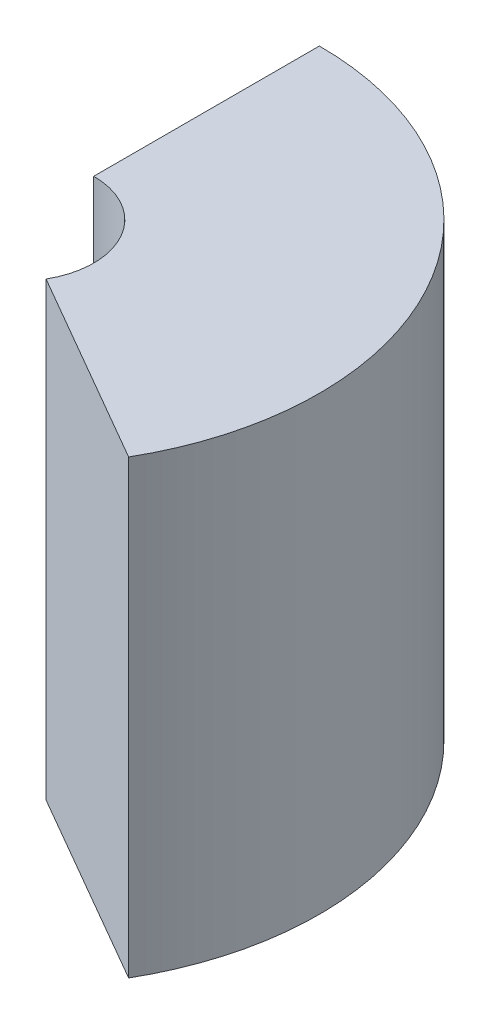
ISO-10303-21;
HEADER;
FILE_DESCRIPTION(('STEP AP214'),'2;1');
FILE_NAME('part.step','',(''),(''),'','','');
FILE_SCHEMA(('AUTOMOTIVE_DESIGN { 1 0 10303 214 1 1 1 1 }'));
ENDSEC;
DATA;
#1=APPLICATION_CONTEXT('core data for automotive mechanical design processes');
#2=APPLICATION_PROTOCOL_DEFINITION('international standard','automotive_design',2000,#1);
#3=PRODUCT_CONTEXT('',#1,'mechanical');
#4=PRODUCT('Part','Part','',(#3));
#5=PRODUCT_RELATED_PRODUCT_CATEGORY('part','',(#4));
#6=PRODUCT_DEFINITION_FORMATION('','',#4);
#7=PRODUCT_DEFINITION_CONTEXT('part definition',#1,'design');
#8=PRODUCT_DEFINITION('design','',#6,#7);
#9=PRODUCT_DEFINITION_SHAPE('','',#8);
#10=(LENGTH_UNIT() NAMED_UNIT(*) SI_UNIT(.MILLI.,.METRE.));
#11=(NAMED_UNIT(*) PLANE_ANGLE_UNIT() SI_UNIT($,.RADIAN.));
#12=(NAMED_UNIT(*) SI_UNIT($,.STERADIAN.) SOLID_ANGLE_UNIT());
#13=UNCERTAINTY_MEASURE_WITH_UNIT(LENGTH_MEASURE(1.E-05),#10,'distance_accuracy_value','');
#14=(GEOMETRIC_REPRESENTATION_CONTEXT(3) GLOBAL_UNCERTAINTY_ASSIGNED_CONTEXT((#13)) GLOBAL_UNIT_ASSIGNED_CONTEXT((#10,
#11,#12)) REPRESENTATION_CONTEXT('',''));
#15=CARTESIAN_POINT('',(0.,0.,0.));
#16=DIRECTION('',(0.,0.,1.));
#17=DIRECTION('',(1.,0.,0.));
#18=AXIS2_PLACEMENT_3D('',#15,#16,#17);
#19=CARTESIAN_POINT('',(0.,0.,0.));
#20=DIRECTION('',(0.,1.,0.));
#21=DIRECTION('',(0.,0.,1.));
#22=AXIS2_PLACEMENT_3D('',#19,#20,#21);
#23=CYLINDRICAL_SURFACE('',#22,5.);
#24=CARTESIAN_POINT('',(0.,0.,0.));
#25=DIRECTION('',(0.,1.,0.));
#26=DIRECTION('',(0.,0.,1.));
#27=AXIS2_PLACEMENT_3D('',#24,#25,#26);
#28=CIRCLE('',#27,5.);
#29=CARTESIAN_POINT('',(4.33012701892219,0.,2.5));
#30=VERTEX_POINT('',#29);
#31=CARTESIAN_POINT('',(0.,0.,-5.));
#32=VERTEX_POINT('',#31);
#33=EDGE_CURVE('E11',#30,#32,#28,.T.);
#34=ORIENTED_EDGE('',*,*,#33,.F.);
#35=DIRECTION('',(0.,-1.,0.));
#36=VECTOR('',#35,1.);
#37=CARTESIAN_POINT('',(4.33012701892219,30.,2.5));
#38=LINE('',#37,#36);
#39=CARTESIAN_POINT('',(4.33012701892219,30.,2.5));
#40=VERTEX_POINT('',#39);
#41=EDGE_CURVE('E103',#40,#30,#38,.T.);
#42=ORIENTED_EDGE('',*,*,#41,.F.);
#43=CARTESIAN_POINT('',(0.,30.,0.));
#44=DIRECTION('',(0.,1.,0.));
#45=DIRECTION('',(0.,0.,1.));
#46=AXIS2_PLACEMENT_3D('',#43,#44,#45);
#47=CIRCLE('',#46,5.);
#48=CARTESIAN_POINT('',(0.,30.,-5.));
#49=VERTEX_POINT('',#48);
#50=EDGE_CURVE('E56',#40,#49,#47,.T.);
#51=ORIENTED_EDGE('',*,*,#50,.T.);
#52=DIRECTION('',(0.,-1.,0.));
#53=VECTOR('',#52,1.);
#54=CARTESIAN_POINT('',(0.,30.,-5.));
#55=LINE('',#54,#53);
#56=EDGE_CURVE('E92',#49,#32,#55,.T.);
#57=ORIENTED_EDGE('',*,*,#56,.T.);
#58=EDGE_LOOP('',(#34,#42,#51,#57));
#59=FACE_BOUND('',#58,.T.);
#60=ADVANCED_FACE('F41',(#59),#23,.F.);
#61=CARTESIAN_POINT('',(4.33012701892219,0.,2.5));
#62=DIRECTION('',(0.,1.,0.));
#63=DIRECTION('',(0.,0.,1.));
#64=AXIS2_PLACEMENT_3D('',#61,#62,#63);
#65=PLANE('',#64);
#66=CARTESIAN_POINT('',(0.,0.,0.));
#67=DIRECTION('',(0.,1.,0.));
#68=DIRECTION('',(0.,0.,1.));
#69=AXIS2_PLACEMENT_3D('',#66,#67,#68);
#70=CIRCLE('',#69,20.);
#71=CARTESIAN_POINT('',(17.3205080756888,0.,9.99999999999999));
#72=VERTEX_POINT('',#71);
#73=CARTESIAN_POINT('',(0.,0.,-20.));
#74=VERTEX_POINT('',#73);
#75=EDGE_CURVE('E49',#72,#74,#70,.T.);
#76=ORIENTED_EDGE('',*,*,#75,.F.);
#77=DIRECTION('',(0.866025403784439,0.,0.5));
#78=VECTOR('',#77,1.);
#79=CARTESIAN_POINT('',(4.33012701892219,0.,2.5));
#80=LINE('',#79,#78);
#81=EDGE_CURVE('E88',#30,#72,#80,.T.);
#82=ORIENTED_EDGE('',*,*,#81,.F.);
#83=ORIENTED_EDGE('',*,*,#33,.T.);
#84=DIRECTION('',(0.,0.,-1.));
#85=VECTOR('',#84,1.);
#86=CARTESIAN_POINT('',(0.,0.,-5.));
#87=LINE('',#86,#85);
#88=EDGE_CURVE('E85',#32,#74,#87,.T.);
#89=ORIENTED_EDGE('',*,*,#88,.T.);
#90=EDGE_LOOP('',(#76,#82,#83,#89));
#91=FACE_BOUND('',#90,.T.);
#92=ADVANCED_FACE('F43',(#91),#65,.F.);
#93=CARTESIAN_POINT('',(0.,0.,0.));
#94=DIRECTION('',(0.,1.,0.));
#95=DIRECTION('',(0.,0.,1.));
#96=AXIS2_PLACEMENT_3D('',#93,#94,#95);
#97=CYLINDRICAL_SURFACE('',#96,20.);
#98=CARTESIAN_POINT('',(0.,30.,0.));
#99=DIRECTION('',(0.,1.,0.));
#100=DIRECTION('',(0.,0.,1.));
#101=AXIS2_PLACEMENT_3D('',#98,#99,#100);
#102=CIRCLE('',#101,20.);
#103=CARTESIAN_POINT('',(17.3205080756888,30.,9.99999999999999));
#104=VERTEX_POINT('',#103);
#105=CARTESIAN_POINT('',(0.,30.,-20.));
#106=VERTEX_POINT('',#105);
#107=EDGE_CURVE('E64',#104,#106,#102,.T.);
#108=ORIENTED_EDGE('',*,*,#107,.F.);
#109=DIRECTION('',(0.,1.,0.));
#110=VECTOR('',#109,1.);
#111=CARTESIAN_POINT('',(17.3205080756888,0.,9.99999999999999));
#112=LINE('',#111,#110);
#113=EDGE_CURVE('E106',#72,#104,#112,.T.);
#114=ORIENTED_EDGE('',*,*,#113,.F.);
#115=ORIENTED_EDGE('',*,*,#75,.T.);
#116=DIRECTION('',(0.,1.,0.));
#117=VECTOR('',#116,1.);
#118=CARTESIAN_POINT('',(0.,0.,-20.));
#119=LINE('',#118,#117);
#120=EDGE_CURVE('E97',#74,#106,#119,.T.);
#121=ORIENTED_EDGE('',*,*,#120,.T.);
#122=EDGE_LOOP('',(#108,#114,#115,#121));
#123=FACE_BOUND('',#122,.T.);
#124=ADVANCED_FACE('F112',(#123),#97,.T.);
#125=CARTESIAN_POINT('',(17.3205080756888,30.,9.99999999999999));
#126=DIRECTION('',(0.,-1.,0.));
#127=DIRECTION('',(0.,0.,-1.));
#128=AXIS2_PLACEMENT_3D('',#125,#126,#127);
#129=PLANE('',#128);
#130=DIRECTION('',(-0.866025403784439,0.,-0.5));
#131=VECTOR('',#130,1.);
#132=CARTESIAN_POINT('',(17.3205080756888,30.,9.99999999999999));
#133=LINE('',#132,#131);
#134=EDGE_CURVE('E108',#104,#40,#133,.T.);
#135=ORIENTED_EDGE('',*,*,#134,.F.);
#136=ORIENTED_EDGE('',*,*,#107,.T.);
#137=DIRECTION('',(0.,0.,1.));
#138=VECTOR('',#137,1.);
#139=CARTESIAN_POINT('',(0.,30.,-20.));
#140=LINE('',#139,#138);
#141=EDGE_CURVE('E99',#106,#49,#140,.T.);
#142=ORIENTED_EDGE('',*,*,#141,.T.);
#143=ORIENTED_EDGE('',*,*,#50,.F.);
#144=EDGE_LOOP('',(#135,#136,#142,#143));
#145=FACE_BOUND('',#144,.T.);
#146=ADVANCED_FACE('F115',(#145),#129,.F.);
#147=CARTESIAN_POINT('',(0.,0.,0.));
#148=DIRECTION('',(-0.5,0.,0.866025403784439));
#149=DIRECTION('',(0.866025403784439,0.,0.5));
#150=AXIS2_PLACEMENT_3D('',#147,#148,#149);
#151=PLANE('',#150);
#152=ORIENTED_EDGE('',*,*,#41,.T.);
#153=ORIENTED_EDGE('',*,*,#81,.T.);
#154=ORIENTED_EDGE('',*,*,#113,.T.);
#155=ORIENTED_EDGE('',*,*,#134,.T.);
#156=EDGE_LOOP('',(#152,#153,#154,#155));
#157=FACE_BOUND('',#156,.T.);
#158=ADVANCED_FACE('F114',(#157),#151,.T.);
#159=CARTESIAN_POINT('',(0.,0.,0.));
#160=DIRECTION('',(1.,0.,0.));
#161=DIRECTION('',(0.,0.,-1.));
#162=AXIS2_PLACEMENT_3D('',#159,#160,#161);
#163=PLANE('',#162);
#164=ORIENTED_EDGE('',*,*,#56,.F.);
#165=ORIENTED_EDGE('',*,*,#141,.F.);
#166=ORIENTED_EDGE('',*,*,#120,.F.);
#167=ORIENTED_EDGE('',*,*,#88,.F.);
#168=EDGE_LOOP('',(#164,#165,#166,#167));
#169=FACE_BOUND('',#168,.T.);
#170=ADVANCED_FACE('F96',(#169),#163,.F.);
#171=CLOSED_SHELL('',(#60,#92,#124,#146,#158,#170));
#172=MANIFOLD_SOLID_BREP('B2',#171);
#173=ADVANCED_BREP_SHAPE_REPRESENTATION('',(#18,#172),#14);
#174=SHAPE_DEFINITION_REPRESENTATION(#9,#173);
ENDSEC;
END-ISO-10303-21;
